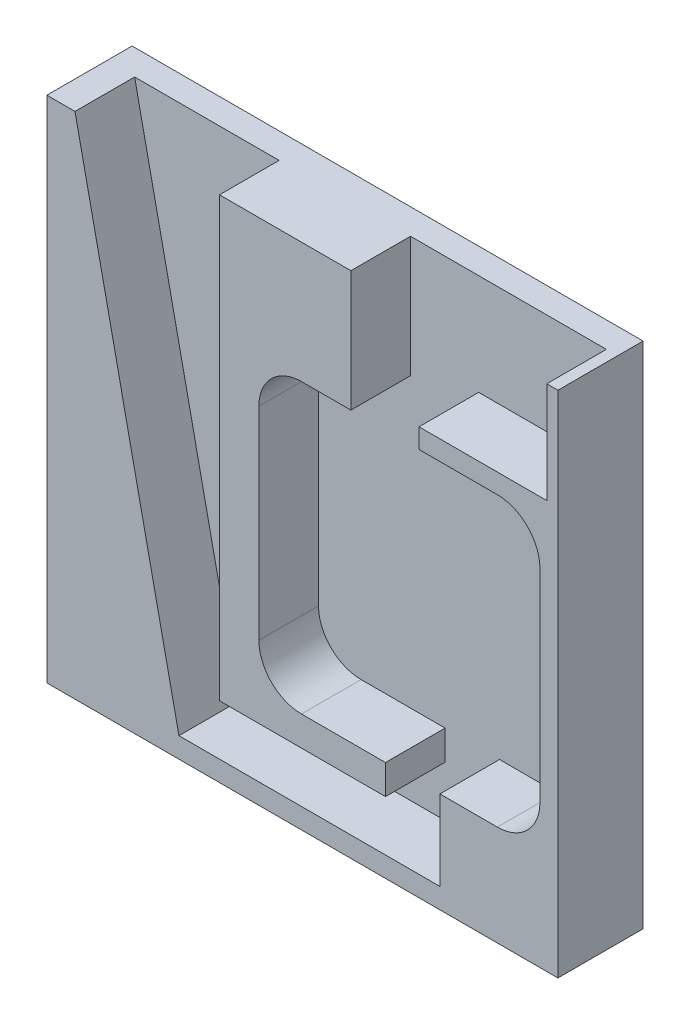
ISO-10303-21;
HEADER;
FILE_DESCRIPTION(('STEP AP214'),'2;1');
FILE_NAME('part.step','',(''),(''),'','','');
FILE_SCHEMA(('AUTOMOTIVE_DESIGN { 1 0 10303 214 1 1 1 1 }'));
ENDSEC;
DATA;
#1=APPLICATION_CONTEXT('core data for automotive mechanical design processes');
#2=APPLICATION_PROTOCOL_DEFINITION('international standard','automotive_design',2000,#1);
#3=PRODUCT_CONTEXT('',#1,'mechanical');
#4=PRODUCT('Part','Part','',(#3));
#5=PRODUCT_RELATED_PRODUCT_CATEGORY('part','',(#4));
#6=PRODUCT_DEFINITION_FORMATION('','',#4);
#7=PRODUCT_DEFINITION_CONTEXT('part definition',#1,'design');
#8=PRODUCT_DEFINITION('design','',#6,#7);
#9=PRODUCT_DEFINITION_SHAPE('','',#8);
#10=(LENGTH_UNIT() NAMED_UNIT(*) SI_UNIT(.MILLI.,.METRE.));
#11=(NAMED_UNIT(*) PLANE_ANGLE_UNIT() SI_UNIT($,.RADIAN.));
#12=(NAMED_UNIT(*) SI_UNIT($,.STERADIAN.) SOLID_ANGLE_UNIT());
#13=UNCERTAINTY_MEASURE_WITH_UNIT(LENGTH_MEASURE(1.E-05),#10,'distance_accuracy_value','');
#14=(GEOMETRIC_REPRESENTATION_CONTEXT(3) GLOBAL_UNCERTAINTY_ASSIGNED_CONTEXT((#13)) GLOBAL_UNIT_ASSIGNED_CONTEXT((#10,
#11,#12)) REPRESENTATION_CONTEXT('',''));
#15=CARTESIAN_POINT('',(0.,0.,0.));
#16=DIRECTION('',(0.,0.,1.));
#17=DIRECTION('',(1.,0.,0.));
#18=AXIS2_PLACEMENT_3D('',#15,#16,#17);
#19=CARTESIAN_POINT('',(0.,0.,10.));
#20=DIRECTION('',(0.,0.,1.));
#21=DIRECTION('',(1.,0.,0.));
#22=AXIS2_PLACEMENT_3D('',#19,#20,#21);
#23=PLANE('',#22);
#24=DIRECTION('',(0.,1.,0.));
#25=VECTOR('',#24,1.);
#26=CARTESIAN_POINT('',(7.9560990337825,-15.2293808870313,10.));
#27=LINE('',#26,#25);
#28=CARTESIAN_POINT('',(7.9560990337825,-24.6301306606249,10.));
#29=VERTEX_POINT('',#28);
#30=CARTESIAN_POINT('',(7.9560990337825,-15.2293808870313,10.));
#31=VERTEX_POINT('',#30);
#32=EDGE_CURVE('E261',#29,#31,#27,.T.);
#33=ORIENTED_EDGE('',*,*,#32,.F.);
#34=DIRECTION('',(1.,0.,0.));
#35=VECTOR('',#34,1.);
#36=CARTESIAN_POINT('',(1.56316592068764,-24.6301306606249,10.));
#37=LINE('',#36,#35);
#38=CARTESIAN_POINT('',(-22.6888435266912,-24.6301306606249,10.));
#39=VERTEX_POINT('',#38);
#40=EDGE_CURVE('E263',#39,#29,#37,.T.);
#41=ORIENTED_EDGE('',*,*,#40,.F.);
#42=DIRECTION('',(0.207957062909339,-0.97813795549816,0.));
#43=VECTOR('',#42,1.);
#44=CARTESIAN_POINT('',(-34.8884993322926,32.751649118956,10.));
#45=LINE('',#44,#43);
#46=CARTESIAN_POINT('',(-34.8884993322926,32.751649118956,10.));
#47=VERTEX_POINT('',#46);
#48=EDGE_CURVE('E281',#47,#39,#45,.T.);
#49=ORIENTED_EDGE('',*,*,#48,.F.);
#50=DIRECTION('',(-1.,0.,0.));
#51=VECTOR('',#50,1.);
#52=CARTESIAN_POINT('',(-28.1873658709764,32.7516491189561,10.));
#53=LINE('',#52,#51);
#54=CARTESIAN_POINT('',(-38.1873658709764,32.751649118956,10.));
#55=VERTEX_POINT('',#54);
#56=EDGE_CURVE('E408',#47,#55,#53,.T.);
#57=ORIENTED_EDGE('',*,*,#56,.T.);
#58=DIRECTION('',(0.,-1.,0.));
#59=VECTOR('',#58,1.);
#60=CARTESIAN_POINT('',(-38.1873658709764,32.751649118956,10.));
#61=LINE('',#60,#59);
#62=CARTESIAN_POINT('',(-38.1873658709764,-27.0178526667206,10.));
#63=VERTEX_POINT('',#62);
#64=EDGE_CURVE('E406',#55,#63,#61,.T.);
#65=ORIENTED_EDGE('',*,*,#64,.T.);
#66=DIRECTION('',(1.,0.,0.));
#67=VECTOR('',#66,1.);
#68=CARTESIAN_POINT('',(-28.1873658709764,-27.0178526667206,10.));
#69=LINE('',#68,#67);
#70=CARTESIAN_POINT('',(21.8126341290236,-27.0178526667206,10.));
#71=VERTEX_POINT('',#70);
#72=EDGE_CURVE('E410',#63,#71,#69,.T.);
#73=ORIENTED_EDGE('',*,*,#72,.T.);
#74=DIRECTION('',(0.,1.,0.));
#75=VECTOR('',#74,1.);
#76=CARTESIAN_POINT('',(21.8126341290236,32.7516491189561,10.));
#77=LINE('',#76,#75);
#78=CARTESIAN_POINT('',(21.8126341290236,32.7516491189561,10.));
#79=VERTEX_POINT('',#78);
#80=EDGE_CURVE('E412',#71,#79,#77,.T.);
#81=ORIENTED_EDGE('',*,*,#80,.T.);
#82=CARTESIAN_POINT('',(20.503263717641,32.751649118956,10.));
#83=VERTEX_POINT('',#82);
#84=EDGE_CURVE('E403',#79,#83,#53,.T.);
#85=ORIENTED_EDGE('',*,*,#84,.T.);
#86=DIRECTION('',(0.,-1.,0.));
#87=VECTOR('',#86,1.);
#88=CARTESIAN_POINT('',(20.503263717641,32.751649118956,10.));
#89=LINE('',#88,#87);
#90=CARTESIAN_POINT('',(20.503263717641,20.8766844809505,10.));
#91=VERTEX_POINT('',#90);
#92=EDGE_CURVE('E326',#83,#91,#89,.T.);
#93=ORIENTED_EDGE('',*,*,#92,.T.);
#94=DIRECTION('',(1.,0.,0.));
#95=VECTOR('',#94,1.);
#96=CARTESIAN_POINT('',(5.503263717641,20.8766844809505,10.));
#97=LINE('',#96,#95);
#98=CARTESIAN_POINT('',(5.503263717641,20.8766844809505,10.));
#99=VERTEX_POINT('',#98);
#100=EDGE_CURVE('E288',#99,#91,#97,.T.);
#101=ORIENTED_EDGE('',*,*,#100,.F.);
#102=DIRECTION('',(0.,-1.,0.));
#103=VECTOR('',#102,1.);
#104=CARTESIAN_POINT('',(5.503263717641,32.751649118956,10.));
#105=LINE('',#104,#103);
#106=CARTESIAN_POINT('',(5.503263717641,18.5706191129687,10.));
#107=VERTEX_POINT('',#106);
#108=EDGE_CURVE('E310',#99,#107,#105,.T.);
#109=ORIENTED_EDGE('',*,*,#108,.T.);
#110=DIRECTION('',(1.,0.,0.));
#111=VECTOR('',#110,1.);
#112=CARTESIAN_POINT('',(-8.29842081927149,18.5706191129687,10.));
#113=LINE('',#112,#111);
#114=CARTESIAN_POINT('',(14.7015791807285,18.5706191129687,10.));
#115=VERTEX_POINT('',#114);
#116=EDGE_CURVE('E381',#107,#115,#113,.T.);
#117=ORIENTED_EDGE('',*,*,#116,.T.);
#118=CARTESIAN_POINT('',(14.7015791807285,13.5706191129687,10.));
#119=DIRECTION('',(0.,0.,1.));
#120=DIRECTION('',(1.,0.,0.));
#121=AXIS2_PLACEMENT_3D('',#118,#119,#120);
#122=CIRCLE('',#121,5.);
#123=CARTESIAN_POINT('',(19.7015791807285,13.5706191129687,10.));
#124=VERTEX_POINT('',#123);
#125=EDGE_CURVE('E378',#124,#115,#122,.T.);
#126=ORIENTED_EDGE('',*,*,#125,.F.);
#127=DIRECTION('',(0.,-1.,0.));
#128=VECTOR('',#127,1.);
#129=CARTESIAN_POINT('',(19.7015791807285,13.5706191129687,10.));
#130=LINE('',#129,#128);
#131=CARTESIAN_POINT('',(19.7015791807285,-10.2293808870313,10.));
#132=VERTEX_POINT('',#131);
#133=EDGE_CURVE('E375',#124,#132,#130,.T.);
#134=ORIENTED_EDGE('',*,*,#133,.T.);
#135=CARTESIAN_POINT('',(14.7015791807285,-10.2293808870313,10.));
#136=DIRECTION('',(0.,0.,1.));
#137=DIRECTION('',(1.,0.,0.));
#138=AXIS2_PLACEMENT_3D('',#135,#136,#137);
#139=CIRCLE('',#138,5.);
#140=CARTESIAN_POINT('',(14.7015791807285,-15.2293808870313,10.));
#141=VERTEX_POINT('',#140);
#142=EDGE_CURVE('E372',#141,#132,#139,.T.);
#143=ORIENTED_EDGE('',*,*,#142,.F.);
#144=DIRECTION('',(1.,0.,0.));
#145=VECTOR('',#144,1.);
#146=CARTESIAN_POINT('',(-8.29842081927149,-15.2293808870313,10.));
#147=LINE('',#146,#145);
#148=EDGE_CURVE('E368',#31,#141,#147,.T.);
#149=ORIENTED_EDGE('',*,*,#148,.F.);
#150=EDGE_LOOP('',(#33,#41,#49,#57,#65,#73,#81,#85,#93,#101,#109,#117,#126,#134,#143,#149));
#151=FACE_BOUND('',#150,.T.);
#152=ADVANCED_FACE('F63',(#151),#23,.T.);
#153=CARTESIAN_POINT('',(-8.29842081927149,-15.2293808870313,3.));
#154=DIRECTION('',(0.,-1.,0.));
#155=DIRECTION('',(0.,0.,-1.));
#156=AXIS2_PLACEMENT_3D('',#153,#154,#155);
#157=PLANE('',#156);
#158=CARTESIAN_POINT('',(-8.29842081927149,-15.2293808870313,10.));
#159=VERTEX_POINT('',#158);
#160=CARTESIAN_POINT('',(1.56316592068764,-15.2293808870313,10.));
#161=VERTEX_POINT('',#160);
#162=EDGE_CURVE('E369',#159,#161,#147,.T.);
#163=ORIENTED_EDGE('',*,*,#162,.T.);
#164=DIRECTION('',(0.,0.,1.));
#165=VECTOR('',#164,1.);
#166=CARTESIAN_POINT('',(1.56316592068764,-15.2293808870313,3.));
#167=LINE('',#166,#165);
#168=CARTESIAN_POINT('',(1.56316592068764,-15.2293808870313,3.));
#169=VERTEX_POINT('',#168);
#170=EDGE_CURVE('E286',#169,#161,#167,.T.);
#171=ORIENTED_EDGE('',*,*,#170,.F.);
#172=DIRECTION('',(1.,0.,0.));
#173=VECTOR('',#172,1.);
#174=CARTESIAN_POINT('',(-8.29842081927149,-15.2293808870313,3.));
#175=LINE('',#174,#173);
#176=CARTESIAN_POINT('',(-8.29842081927149,-15.2293808870313,3.));
#177=VERTEX_POINT('',#176);
#178=EDGE_CURVE('E260',#177,#169,#175,.T.);
#179=ORIENTED_EDGE('',*,*,#178,.F.);
#180=DIRECTION('',(0.,0.,1.));
#181=VECTOR('',#180,1.);
#182=CARTESIAN_POINT('',(-8.29842081927149,-15.2293808870313,3.));
#183=LINE('',#182,#181);
#184=EDGE_CURVE('E397',#177,#159,#183,.T.);
#185=ORIENTED_EDGE('',*,*,#184,.T.);
#186=EDGE_LOOP('',(#163,#171,#179,#185));
#187=FACE_BOUND('',#186,.T.);
#188=ADVANCED_FACE('F520',(#187),#157,.F.);
#189=CARTESIAN_POINT('',(-8.29842081927149,18.5706191129687,3.));
#190=DIRECTION('',(0.,-1.,0.));
#191=DIRECTION('',(0.,0.,-1.));
#192=AXIS2_PLACEMENT_3D('',#189,#190,#191);
#193=PLANE('',#192);
#194=ORIENTED_EDGE('',*,*,#116,.F.);
#195=DIRECTION('',(0.,0.,1.));
#196=VECTOR('',#195,1.);
#197=CARTESIAN_POINT('',(5.503263717641,18.5706191129687,3.));
#198=LINE('',#197,#196);
#199=CARTESIAN_POINT('',(5.503263717641,18.5706191129687,3.));
#200=VERTEX_POINT('',#199);
#201=EDGE_CURVE('E309',#200,#107,#198,.T.);
#202=ORIENTED_EDGE('',*,*,#201,.F.);
#203=DIRECTION('',(1.,0.,0.));
#204=VECTOR('',#203,1.);
#205=CARTESIAN_POINT('',(-8.29842081927149,18.5706191129687,3.));
#206=LINE('',#205,#204);
#207=CARTESIAN_POINT('',(14.7015791807285,18.5706191129687,3.));
#208=VERTEX_POINT('',#207);
#209=EDGE_CURVE('E356',#200,#208,#206,.T.);
#210=ORIENTED_EDGE('',*,*,#209,.T.);
#211=DIRECTION('',(0.,0.,1.));
#212=VECTOR('',#211,1.);
#213=CARTESIAN_POINT('',(14.7015791807285,18.5706191129687,3.));
#214=LINE('',#213,#212);
#215=EDGE_CURVE('E387',#208,#115,#214,.T.);
#216=ORIENTED_EDGE('',*,*,#215,.T.);
#217=EDGE_LOOP('',(#194,#202,#210,#216));
#218=FACE_BOUND('',#217,.T.);
#219=ADVANCED_FACE('F496',(#218),#193,.T.);
#220=CARTESIAN_POINT('',(-38.1873658709764,32.751649118956,10.));
#221=DIRECTION('',(1.,0.,0.));
#222=DIRECTION('',(0.,1.,0.));
#223=AXIS2_PLACEMENT_3D('',#220,#221,#222);
#224=PLANE('',#223);
#225=DIRECTION('',(0.,-1.,0.));
#226=VECTOR('',#225,1.);
#227=CARTESIAN_POINT('',(-38.1873658709764,32.751649118956,0.));
#228=LINE('',#227,#226);
#229=CARTESIAN_POINT('',(-38.1873658709764,32.751649118956,0.));
#230=VERTEX_POINT('',#229);
#231=CARTESIAN_POINT('',(-38.1873658709764,-27.0178526667206,0.));
#232=VERTEX_POINT('',#231);
#233=EDGE_CURVE('E386',#230,#232,#228,.T.);
#234=ORIENTED_EDGE('',*,*,#233,.T.);
#235=DIRECTION('',(0.,0.,-1.));
#236=VECTOR('',#235,1.);
#237=CARTESIAN_POINT('',(-38.1873658709764,-27.0178526667206,10.));
#238=LINE('',#237,#236);
#239=EDGE_CURVE('E71',#63,#232,#238,.T.);
#240=ORIENTED_EDGE('',*,*,#239,.F.);
#241=ORIENTED_EDGE('',*,*,#64,.F.);
#242=DIRECTION('',(0.,0.,-1.));
#243=VECTOR('',#242,1.);
#244=CARTESIAN_POINT('',(-38.1873658709764,32.751649118956,10.));
#245=LINE('',#244,#243);
#246=EDGE_CURVE('E12',#55,#230,#245,.T.);
#247=ORIENTED_EDGE('',*,*,#246,.T.);
#248=EDGE_LOOP('',(#234,#240,#241,#247));
#249=FACE_BOUND('',#248,.T.);
#250=ADVANCED_FACE('F65',(#249),#224,.F.);
#251=CARTESIAN_POINT('',(-28.1873658709764,-27.0178526667206,10.));
#252=DIRECTION('',(0.,1.,0.));
#253=DIRECTION('',(0.,0.,1.));
#254=AXIS2_PLACEMENT_3D('',#251,#252,#253);
#255=PLANE('',#254);
#256=DIRECTION('',(1.,0.,0.));
#257=VECTOR('',#256,1.);
#258=CARTESIAN_POINT('',(-28.1873658709764,-27.0178526667206,0.));
#259=LINE('',#258,#257);
#260=CARTESIAN_POINT('',(21.8126341290236,-27.0178526667206,0.));
#261=VERTEX_POINT('',#260);
#262=EDGE_CURVE('E418',#232,#261,#259,.T.);
#263=ORIENTED_EDGE('',*,*,#262,.T.);
#264=DIRECTION('',(0.,0.,-1.));
#265=VECTOR('',#264,1.);
#266=CARTESIAN_POINT('',(21.8126341290236,-27.0178526667206,10.));
#267=LINE('',#266,#265);
#268=EDGE_CURVE('E426',#71,#261,#267,.T.);
#269=ORIENTED_EDGE('',*,*,#268,.F.);
#270=ORIENTED_EDGE('',*,*,#72,.F.);
#271=ORIENTED_EDGE('',*,*,#239,.T.);
#272=EDGE_LOOP('',(#263,#269,#270,#271));
#273=FACE_BOUND('',#272,.T.);
#274=ADVANCED_FACE('F432',(#273),#255,.F.);
#275=CARTESIAN_POINT('',(21.8126341290236,32.7516491189561,10.));
#276=DIRECTION('',(-1.,0.,0.));
#277=DIRECTION('',(0.,-1.,0.));
#278=AXIS2_PLACEMENT_3D('',#275,#276,#277);
#279=PLANE('',#278);
#280=DIRECTION('',(0.,1.,0.));
#281=VECTOR('',#280,1.);
#282=CARTESIAN_POINT('',(21.8126341290236,32.7516491189561,0.));
#283=LINE('',#282,#281);
#284=CARTESIAN_POINT('',(21.8126341290236,32.7516491189561,0.));
#285=VERTEX_POINT('',#284);
#286=EDGE_CURVE('E420',#261,#285,#283,.T.);
#287=ORIENTED_EDGE('',*,*,#286,.T.);
#288=DIRECTION('',(0.,0.,-1.));
#289=VECTOR('',#288,1.);
#290=CARTESIAN_POINT('',(21.8126341290236,32.7516491189561,10.));
#291=LINE('',#290,#289);
#292=EDGE_CURVE('E415',#79,#285,#291,.T.);
#293=ORIENTED_EDGE('',*,*,#292,.F.);
#294=ORIENTED_EDGE('',*,*,#80,.F.);
#295=ORIENTED_EDGE('',*,*,#268,.T.);
#296=EDGE_LOOP('',(#287,#293,#294,#295));
#297=FACE_BOUND('',#296,.T.);
#298=ADVANCED_FACE('F444',(#297),#279,.F.);
#299=CARTESIAN_POINT('',(-28.1873658709764,32.7516491189561,10.));
#300=DIRECTION('',(0.,-1.,0.));
#301=DIRECTION('',(0.,0.,-1.));
#302=AXIS2_PLACEMENT_3D('',#299,#300,#301);
#303=PLANE('',#302);
#304=ORIENTED_EDGE('',*,*,#56,.F.);
#305=DIRECTION('',(0.,0.,1.));
#306=VECTOR('',#305,1.);
#307=CARTESIAN_POINT('',(-34.8884993322926,32.751649118956,3.));
#308=LINE('',#307,#306);
#309=CARTESIAN_POINT('',(-34.8884993322926,32.751649118956,3.));
#310=VERTEX_POINT('',#309);
#311=EDGE_CURVE('E296',#310,#47,#308,.T.);
#312=ORIENTED_EDGE('',*,*,#311,.F.);
#313=DIRECTION('',(-1.,0.,0.));
#314=VECTOR('',#313,1.);
#315=CARTESIAN_POINT('',(-17.9237265806738,32.751649118956,3.));
#316=LINE('',#315,#314);
#317=CARTESIAN_POINT('',(-17.9237265806738,32.751649118956,3.));
#318=VERTEX_POINT('',#317);
#319=EDGE_CURVE('E267',#318,#310,#316,.T.);
#320=ORIENTED_EDGE('',*,*,#319,.F.);
#321=DIRECTION('',(0.,0.,1.));
#322=VECTOR('',#321,1.);
#323=CARTESIAN_POINT('',(-17.9237265806738,32.751649118956,3.));
#324=LINE('',#323,#322);
#325=CARTESIAN_POINT('',(-17.9237265806738,32.751649118956,10.));
#326=VERTEX_POINT('',#325);
#327=EDGE_CURVE('E298',#318,#326,#324,.T.);
#328=ORIENTED_EDGE('',*,*,#327,.T.);
#329=CARTESIAN_POINT('',(-2.496736282359,32.751649118956,10.));
#330=VERTEX_POINT('',#329);
#331=EDGE_CURVE('E407',#330,#326,#53,.T.);
#332=ORIENTED_EDGE('',*,*,#331,.F.);
#333=DIRECTION('',(0.,0.,1.));
#334=VECTOR('',#333,1.);
#335=CARTESIAN_POINT('',(-2.496736282359,32.751649118956,3.));
#336=LINE('',#335,#334);
#337=CARTESIAN_POINT('',(-2.496736282359,32.751649118956,3.));
#338=VERTEX_POINT('',#337);
#339=EDGE_CURVE('E319',#338,#330,#336,.T.);
#340=ORIENTED_EDGE('',*,*,#339,.F.);
#341=DIRECTION('',(1.,0.,0.));
#342=VECTOR('',#341,1.);
#343=CARTESIAN_POINT('',(-2.496736282359,32.751649118956,3.));
#344=LINE('',#343,#342);
#345=CARTESIAN_POINT('',(20.503263717641,32.751649118956,3.));
#346=VERTEX_POINT('',#345);
#347=EDGE_CURVE('E304',#338,#346,#344,.T.);
#348=ORIENTED_EDGE('',*,*,#347,.T.);
#349=DIRECTION('',(0.,0.,1.));
#350=VECTOR('',#349,1.);
#351=CARTESIAN_POINT('',(20.503263717641,32.751649118956,3.));
#352=LINE('',#351,#350);
#353=EDGE_CURVE('E313',#346,#83,#352,.T.);
#354=ORIENTED_EDGE('',*,*,#353,.T.);
#355=ORIENTED_EDGE('',*,*,#84,.F.);
#356=ORIENTED_EDGE('',*,*,#292,.T.);
#357=DIRECTION('',(-1.,0.,0.));
#358=VECTOR('',#357,1.);
#359=CARTESIAN_POINT('',(-28.1873658709764,32.7516491189561,0.));
#360=LINE('',#359,#358);
#361=EDGE_CURVE('E422',#285,#230,#360,.T.);
#362=ORIENTED_EDGE('',*,*,#361,.T.);
#363=ORIENTED_EDGE('',*,*,#246,.F.);
#364=EDGE_LOOP('',(#304,#312,#320,#328,#332,#340,#348,#354,#355,#356,#362,#363));
#365=FACE_BOUND('',#364,.T.);
#366=ADVANCED_FACE('F448',(#365),#303,.F.);
#367=DIRECTION('',(0.,-1.,0.));
#368=VECTOR('',#367,1.);
#369=CARTESIAN_POINT('',(1.56316592068764,-15.2293808870313,10.));
#370=LINE('',#369,#368);
#371=CARTESIAN_POINT('',(1.56316592068764,-18.6993372906454,10.));
#372=VERTEX_POINT('',#371);
#373=EDGE_CURVE('E242',#161,#372,#370,.T.);
#374=ORIENTED_EDGE('',*,*,#373,.F.);
#375=ORIENTED_EDGE('',*,*,#162,.F.);
#376=CARTESIAN_POINT('',(-8.2984208192715,-10.2293808870313,10.));
#377=DIRECTION('',(0.,0.,-1.));
#378=DIRECTION('',(-1.,0.,0.));
#379=AXIS2_PLACEMENT_3D('',#376,#377,#378);
#380=CIRCLE('',#379,5.);
#381=CARTESIAN_POINT('',(-13.2984208192715,-10.2293808870313,10.));
#382=VERTEX_POINT('',#381);
#383=EDGE_CURVE('E365',#159,#382,#380,.T.);
#384=ORIENTED_EDGE('',*,*,#383,.T.);
#385=DIRECTION('',(0.,-1.,0.));
#386=VECTOR('',#385,1.);
#387=CARTESIAN_POINT('',(-13.2984208192715,13.5706191129687,10.));
#388=LINE('',#387,#386);
#389=CARTESIAN_POINT('',(-13.2984208192715,13.5706191129687,10.));
#390=VERTEX_POINT('',#389);
#391=EDGE_CURVE('E362',#390,#382,#388,.T.);
#392=ORIENTED_EDGE('',*,*,#391,.F.);
#393=CARTESIAN_POINT('',(-8.2984208192715,13.5706191129687,10.));
#394=DIRECTION('',(0.,0.,1.));
#395=DIRECTION('',(1.,0.,0.));
#396=AXIS2_PLACEMENT_3D('',#393,#394,#395);
#397=CIRCLE('',#396,5.);
#398=CARTESIAN_POINT('',(-8.29842081927149,18.5706191129687,10.));
#399=VERTEX_POINT('',#398);
#400=EDGE_CURVE('E334',#399,#390,#397,.T.);
#401=ORIENTED_EDGE('',*,*,#400,.F.);
#402=CARTESIAN_POINT('',(-2.496736282359,18.5706191129687,10.));
#403=VERTEX_POINT('',#402);
#404=EDGE_CURVE('E341',#399,#403,#113,.T.);
#405=ORIENTED_EDGE('',*,*,#404,.T.);
#406=DIRECTION('',(0.,-1.,0.));
#407=VECTOR('',#406,1.);
#408=CARTESIAN_POINT('',(-2.496736282359,32.751649118956,10.));
#409=LINE('',#408,#407);
#410=EDGE_CURVE('E305',#330,#403,#409,.T.);
#411=ORIENTED_EDGE('',*,*,#410,.F.);
#412=ORIENTED_EDGE('',*,*,#331,.T.);
#413=DIRECTION('',(0.,1.,0.));
#414=VECTOR('',#413,1.);
#415=CARTESIAN_POINT('',(-17.9237265806738,-18.6993372906454,10.));
#416=LINE('',#415,#414);
#417=CARTESIAN_POINT('',(-17.9237265806738,-18.6993372906454,10.));
#418=VERTEX_POINT('',#417);
#419=EDGE_CURVE('E279',#418,#326,#416,.T.);
#420=ORIENTED_EDGE('',*,*,#419,.F.);
#421=DIRECTION('',(-1.,0.,0.));
#422=VECTOR('',#421,1.);
#423=CARTESIAN_POINT('',(-17.9237265806738,-18.6993372906454,10.));
#424=LINE('',#423,#422);
#425=EDGE_CURVE('E277',#372,#418,#424,.T.);
#426=ORIENTED_EDGE('',*,*,#425,.F.);
#427=EDGE_LOOP('',(#374,#375,#384,#392,#401,#405,#411,#412,#420,#426));
#428=FACE_BOUND('',#427,.T.);
#429=ADVANCED_FACE('F459',(#428),#23,.T.);
#430=CARTESIAN_POINT('',(0.,0.,0.));
#431=DIRECTION('',(0.,0.,1.));
#432=DIRECTION('',(1.,0.,0.));
#433=AXIS2_PLACEMENT_3D('',#430,#431,#432);
#434=PLANE('',#433);
#435=ORIENTED_EDGE('',*,*,#233,.F.);
#436=ORIENTED_EDGE('',*,*,#361,.F.);
#437=ORIENTED_EDGE('',*,*,#286,.F.);
#438=ORIENTED_EDGE('',*,*,#262,.F.);
#439=EDGE_LOOP('',(#435,#436,#437,#438));
#440=FACE_BOUND('',#439,.T.);
#441=ADVANCED_FACE('F440',(#440),#434,.F.);
#442=CARTESIAN_POINT('',(-8.2984208192715,13.5706191129687,3.));
#443=DIRECTION('',(0.,0.,1.));
#444=DIRECTION('',(1.,0.,0.));
#445=AXIS2_PLACEMENT_3D('',#442,#443,#444);
#446=CYLINDRICAL_SURFACE('',#445,5.);
#447=ORIENTED_EDGE('',*,*,#400,.T.);
#448=DIRECTION('',(0.,0.,1.));
#449=VECTOR('',#448,1.);
#450=CARTESIAN_POINT('',(-13.2984208192715,13.5706191129687,3.));
#451=LINE('',#450,#449);
#452=CARTESIAN_POINT('',(-13.2984208192715,13.5706191129687,3.));
#453=VERTEX_POINT('',#452);
#454=EDGE_CURVE('E360',#453,#390,#451,.T.);
#455=ORIENTED_EDGE('',*,*,#454,.F.);
#456=CARTESIAN_POINT('',(-8.2984208192715,13.5706191129687,3.));
#457=DIRECTION('',(0.,0.,1.));
#458=DIRECTION('',(1.,0.,0.));
#459=AXIS2_PLACEMENT_3D('',#456,#457,#458);
#460=CIRCLE('',#459,5.);
#461=CARTESIAN_POINT('',(-8.29842081927149,18.5706191129687,3.));
#462=VERTEX_POINT('',#461);
#463=EDGE_CURVE('E338',#462,#453,#460,.T.);
#464=ORIENTED_EDGE('',*,*,#463,.F.);
#465=DIRECTION('',(0.,0.,1.));
#466=VECTOR('',#465,1.);
#467=CARTESIAN_POINT('',(-8.29842081927149,18.5706191129687,3.));
#468=LINE('',#467,#466);
#469=EDGE_CURVE('E384',#462,#399,#468,.T.);
#470=ORIENTED_EDGE('',*,*,#469,.T.);
#471=EDGE_LOOP('',(#447,#455,#464,#470));
#472=FACE_BOUND('',#471,.T.);
#473=ADVANCED_FACE('F535',(#472),#446,.F.);
#474=DIRECTION('',(0.,0.,1.));
#475=VECTOR('',#474,1.);
#476=CARTESIAN_POINT('',(-2.496736282359,18.5706191129687,3.));
#477=LINE('',#476,#475);
#478=CARTESIAN_POINT('',(-2.496736282359,18.5706191129687,3.));
#479=VERTEX_POINT('',#478);
#480=EDGE_CURVE('E315',#479,#403,#477,.T.);
#481=ORIENTED_EDGE('',*,*,#480,.T.);
#482=ORIENTED_EDGE('',*,*,#404,.F.);
#483=ORIENTED_EDGE('',*,*,#469,.F.);
#484=EDGE_CURVE('E357',#462,#479,#206,.T.);
#485=ORIENTED_EDGE('',*,*,#484,.T.);
#486=EDGE_LOOP('',(#481,#482,#483,#485));
#487=FACE_BOUND('',#486,.T.);
#488=ADVANCED_FACE('F549',(#487),#193,.T.);
#489=CARTESIAN_POINT('',(14.7015791807285,13.5706191129687,3.));
#490=DIRECTION('',(0.,0.,1.));
#491=DIRECTION('',(1.,0.,0.));
#492=AXIS2_PLACEMENT_3D('',#489,#490,#491);
#493=CYLINDRICAL_SURFACE('',#492,5.);
#494=ORIENTED_EDGE('',*,*,#125,.T.);
#495=ORIENTED_EDGE('',*,*,#215,.F.);
#496=CARTESIAN_POINT('',(14.7015791807285,13.5706191129687,3.));
#497=DIRECTION('',(0.,0.,1.));
#498=DIRECTION('',(1.,0.,0.));
#499=AXIS2_PLACEMENT_3D('',#496,#497,#498);
#500=CIRCLE('',#499,5.);
#501=CARTESIAN_POINT('',(19.7015791807285,13.5706191129687,3.));
#502=VERTEX_POINT('',#501);
#503=EDGE_CURVE('E353',#502,#208,#500,.T.);
#504=ORIENTED_EDGE('',*,*,#503,.F.);
#505=DIRECTION('',(0.,0.,1.));
#506=VECTOR('',#505,1.);
#507=CARTESIAN_POINT('',(19.7015791807285,13.5706191129687,3.));
#508=LINE('',#507,#506);
#509=EDGE_CURVE('E390',#502,#124,#508,.T.);
#510=ORIENTED_EDGE('',*,*,#509,.T.);
#511=EDGE_LOOP('',(#494,#495,#504,#510));
#512=FACE_BOUND('',#511,.T.);
#513=ADVANCED_FACE('F489',(#512),#493,.F.);
#514=CARTESIAN_POINT('',(19.7015791807285,13.5706191129687,3.));
#515=DIRECTION('',(-1.,0.,0.));
#516=DIRECTION('',(0.,0.,1.));
#517=AXIS2_PLACEMENT_3D('',#514,#515,#516);
#518=PLANE('',#517);
#519=ORIENTED_EDGE('',*,*,#133,.F.);
#520=ORIENTED_EDGE('',*,*,#509,.F.);
#521=DIRECTION('',(0.,-1.,0.));
#522=VECTOR('',#521,1.);
#523=CARTESIAN_POINT('',(19.7015791807285,13.5706191129687,3.));
#524=LINE('',#523,#522);
#525=CARTESIAN_POINT('',(19.7015791807285,-10.2293808870313,3.));
#526=VERTEX_POINT('',#525);
#527=EDGE_CURVE('E351',#502,#526,#524,.T.);
#528=ORIENTED_EDGE('',*,*,#527,.T.);
#529=DIRECTION('',(0.,0.,1.));
#530=VECTOR('',#529,1.);
#531=CARTESIAN_POINT('',(19.7015791807285,-10.2293808870313,3.));
#532=LINE('',#531,#530);
#533=EDGE_CURVE('E392',#526,#132,#532,.T.);
#534=ORIENTED_EDGE('',*,*,#533,.T.);
#535=EDGE_LOOP('',(#519,#520,#528,#534));
#536=FACE_BOUND('',#535,.T.);
#537=ADVANCED_FACE('F486',(#536),#518,.T.);
#538=CARTESIAN_POINT('',(14.7015791807285,-10.2293808870313,3.));
#539=DIRECTION('',(0.,0.,1.));
#540=DIRECTION('',(1.,0.,0.));
#541=AXIS2_PLACEMENT_3D('',#538,#539,#540);
#542=CYLINDRICAL_SURFACE('',#541,5.);
#543=ORIENTED_EDGE('',*,*,#142,.T.);
#544=ORIENTED_EDGE('',*,*,#533,.F.);
#545=CARTESIAN_POINT('',(14.7015791807285,-10.2293808870313,3.));
#546=DIRECTION('',(0.,0.,1.));
#547=DIRECTION('',(1.,0.,0.));
#548=AXIS2_PLACEMENT_3D('',#545,#546,#547);
#549=CIRCLE('',#548,5.);
#550=CARTESIAN_POINT('',(14.7015791807285,-15.2293808870313,3.));
#551=VERTEX_POINT('',#550);
#552=EDGE_CURVE('E348',#551,#526,#549,.T.);
#553=ORIENTED_EDGE('',*,*,#552,.F.);
#554=DIRECTION('',(0.,0.,1.));
#555=VECTOR('',#554,1.);
#556=CARTESIAN_POINT('',(14.7015791807285,-15.2293808870313,3.));
#557=LINE('',#556,#555);
#558=EDGE_CURVE('E394',#551,#141,#557,.T.);
#559=ORIENTED_EDGE('',*,*,#558,.T.);
#560=EDGE_LOOP('',(#543,#544,#553,#559));
#561=FACE_BOUND('',#560,.T.);
#562=ADVANCED_FACE('F482',(#561),#542,.F.);
#563=CARTESIAN_POINT('',(7.9560990337825,-15.2293808870313,3.));
#564=VERTEX_POINT('',#563);
#565=EDGE_CURVE('E346',#564,#551,#175,.T.);
#566=ORIENTED_EDGE('',*,*,#565,.F.);
#567=DIRECTION('',(0.,0.,1.));
#568=VECTOR('',#567,1.);
#569=CARTESIAN_POINT('',(7.9560990337825,-15.2293808870313,3.));
#570=LINE('',#569,#568);
#571=EDGE_CURVE('E289',#564,#31,#570,.T.);
#572=ORIENTED_EDGE('',*,*,#571,.T.);
#573=ORIENTED_EDGE('',*,*,#148,.T.);
#574=ORIENTED_EDGE('',*,*,#558,.F.);
#575=EDGE_LOOP('',(#566,#572,#573,#574));
#576=FACE_BOUND('',#575,.T.);
#577=ADVANCED_FACE('F476',(#576),#157,.F.);
#578=CARTESIAN_POINT('',(-8.2984208192715,-10.2293808870313,3.));
#579=DIRECTION('',(0.,0.,1.));
#580=DIRECTION('',(1.,0.,0.));
#581=AXIS2_PLACEMENT_3D('',#578,#579,#580);
#582=CYLINDRICAL_SURFACE('',#581,5.);
#583=ORIENTED_EDGE('',*,*,#383,.F.);
#584=ORIENTED_EDGE('',*,*,#184,.F.);
#585=CARTESIAN_POINT('',(-8.2984208192715,-10.2293808870313,3.));
#586=DIRECTION('',(0.,0.,-1.));
#587=DIRECTION('',(-1.,0.,0.));
#588=AXIS2_PLACEMENT_3D('',#585,#586,#587);
#589=CIRCLE('',#588,5.);
#590=CARTESIAN_POINT('',(-13.2984208192715,-10.2293808870313,3.));
#591=VERTEX_POINT('',#590);
#592=EDGE_CURVE('E344',#177,#591,#589,.T.);
#593=ORIENTED_EDGE('',*,*,#592,.T.);
#594=DIRECTION('',(0.,0.,1.));
#595=VECTOR('',#594,1.);
#596=CARTESIAN_POINT('',(-13.2984208192715,-10.2293808870313,3.));
#597=LINE('',#596,#595);
#598=EDGE_CURVE('E399',#591,#382,#597,.T.);
#599=ORIENTED_EDGE('',*,*,#598,.T.);
#600=EDGE_LOOP('',(#583,#584,#593,#599));
#601=FACE_BOUND('',#600,.T.);
#602=ADVANCED_FACE('F575',(#601),#582,.F.);
#603=CARTESIAN_POINT('',(-13.2984208192715,13.5706191129687,3.));
#604=DIRECTION('',(-1.,0.,0.));
#605=DIRECTION('',(0.,-1.,0.));
#606=AXIS2_PLACEMENT_3D('',#603,#604,#605);
#607=PLANE('',#606);
#608=ORIENTED_EDGE('',*,*,#391,.T.);
#609=ORIENTED_EDGE('',*,*,#598,.F.);
#610=DIRECTION('',(0.,-1.,0.));
#611=VECTOR('',#610,1.);
#612=CARTESIAN_POINT('',(-13.2984208192715,13.5706191129687,3.));
#613=LINE('',#612,#611);
#614=EDGE_CURVE('E340',#453,#591,#613,.T.);
#615=ORIENTED_EDGE('',*,*,#614,.F.);
#616=ORIENTED_EDGE('',*,*,#454,.T.);
#617=EDGE_LOOP('',(#608,#609,#615,#616));
#618=FACE_BOUND('',#617,.T.);
#619=ADVANCED_FACE('F570',(#618),#607,.F.);
#620=CARTESIAN_POINT('',(-8.2984208192715,13.5706191129687,3.));
#621=DIRECTION('',(0.,0.,1.));
#622=DIRECTION('',(1.,0.,0.));
#623=AXIS2_PLACEMENT_3D('',#620,#621,#622);
#624=PLANE('',#623);
#625=ORIENTED_EDGE('',*,*,#463,.T.);
#626=ORIENTED_EDGE('',*,*,#614,.T.);
#627=ORIENTED_EDGE('',*,*,#592,.F.);
#628=ORIENTED_EDGE('',*,*,#178,.T.);
#629=DIRECTION('',(0.,-1.,0.));
#630=VECTOR('',#629,1.);
#631=CARTESIAN_POINT('',(1.56316592068764,-15.2293808870313,3.));
#632=LINE('',#631,#630);
#633=CARTESIAN_POINT('',(1.56316592068764,-18.6993372906454,3.));
#634=VERTEX_POINT('',#633);
#635=EDGE_CURVE('E239',#169,#634,#632,.T.);
#636=ORIENTED_EDGE('',*,*,#635,.T.);
#637=DIRECTION('',(-1.,0.,0.));
#638=VECTOR('',#637,1.);
#639=CARTESIAN_POINT('',(-17.9237265806738,-18.6993372906454,3.));
#640=LINE('',#639,#638);
#641=CARTESIAN_POINT('',(-17.9237265806738,-18.6993372906454,3.));
#642=VERTEX_POINT('',#641);
#643=EDGE_CURVE('E249',#634,#642,#640,.T.);
#644=ORIENTED_EDGE('',*,*,#643,.T.);
#645=DIRECTION('',(0.,1.,0.));
#646=VECTOR('',#645,1.);
#647=CARTESIAN_POINT('',(-17.9237265806738,-18.6993372906454,3.));
#648=LINE('',#647,#646);
#649=EDGE_CURVE('E253',#642,#318,#648,.T.);
#650=ORIENTED_EDGE('',*,*,#649,.T.);
#651=ORIENTED_EDGE('',*,*,#319,.T.);
#652=DIRECTION('',(0.207957062909339,-0.97813795549816,0.));
#653=VECTOR('',#652,1.);
#654=CARTESIAN_POINT('',(-34.8884993322926,32.751649118956,3.));
#655=LINE('',#654,#653);
#656=CARTESIAN_POINT('',(-22.6888435266912,-24.6301306606249,3.));
#657=VERTEX_POINT('',#656);
#658=EDGE_CURVE('E270',#310,#657,#655,.T.);
#659=ORIENTED_EDGE('',*,*,#658,.T.);
#660=DIRECTION('',(1.,0.,0.));
#661=VECTOR('',#660,1.);
#662=CARTESIAN_POINT('',(-22.6888435266912,-24.6301306606249,3.));
#663=LINE('',#662,#661);
#664=CARTESIAN_POINT('',(7.9560990337825,-24.6301306606249,3.));
#665=VERTEX_POINT('',#664);
#666=EDGE_CURVE('E273',#657,#665,#663,.T.);
#667=ORIENTED_EDGE('',*,*,#666,.T.);
#668=DIRECTION('',(0.,1.,0.));
#669=VECTOR('',#668,1.);
#670=CARTESIAN_POINT('',(7.9560990337825,-15.2293808870313,3.));
#671=LINE('',#670,#669);
#672=EDGE_CURVE('E78',#665,#564,#671,.T.);
#673=ORIENTED_EDGE('',*,*,#672,.T.);
#674=ORIENTED_EDGE('',*,*,#565,.T.);
#675=ORIENTED_EDGE('',*,*,#552,.T.);
#676=ORIENTED_EDGE('',*,*,#527,.F.);
#677=ORIENTED_EDGE('',*,*,#503,.T.);
#678=ORIENTED_EDGE('',*,*,#209,.F.);
#679=DIRECTION('',(0.,-1.,0.));
#680=VECTOR('',#679,1.);
#681=CARTESIAN_POINT('',(5.503263717641,32.751649118956,3.));
#682=LINE('',#681,#680);
#683=CARTESIAN_POINT('',(5.503263717641,20.8766844809505,3.));
#684=VERTEX_POINT('',#683);
#685=EDGE_CURVE('E302',#684,#200,#682,.T.);
#686=ORIENTED_EDGE('',*,*,#685,.F.);
#687=DIRECTION('',(1.,0.,0.));
#688=VECTOR('',#687,1.);
#689=CARTESIAN_POINT('',(5.503263717641,20.8766844809505,3.));
#690=LINE('',#689,#688);
#691=CARTESIAN_POINT('',(20.503263717641,20.8766844809505,3.));
#692=VERTEX_POINT('',#691);
#693=EDGE_CURVE('E322',#684,#692,#690,.T.);
#694=ORIENTED_EDGE('',*,*,#693,.T.);
#695=DIRECTION('',(0.,-1.,0.));
#696=VECTOR('',#695,1.);
#697=CARTESIAN_POINT('',(20.503263717641,32.751649118956,3.));
#698=LINE('',#697,#696);
#699=EDGE_CURVE('E325',#346,#692,#698,.T.);
#700=ORIENTED_EDGE('',*,*,#699,.F.);
#701=ORIENTED_EDGE('',*,*,#347,.F.);
#702=DIRECTION('',(0.,-1.,0.));
#703=VECTOR('',#702,1.);
#704=CARTESIAN_POINT('',(-2.496736282359,32.751649118956,3.));
#705=LINE('',#704,#703);
#706=EDGE_CURVE('E85',#338,#479,#705,.T.);
#707=ORIENTED_EDGE('',*,*,#706,.T.);
#708=ORIENTED_EDGE('',*,*,#484,.F.);
#709=EDGE_LOOP('',(#625,#626,#627,#628,#636,#644,#650,#651,#659,#667,#673,#674,#675,#676,#677,
#678,#686,#694,#700,#701,#707,#708));
#710=FACE_BOUND('',#709,.T.);
#711=ADVANCED_FACE('F257',(#710),#624,.T.);
#712=CARTESIAN_POINT('',(-2.496736282359,32.751649118956,3.));
#713=DIRECTION('',(-1.,0.,0.));
#714=DIRECTION('',(0.,-1.,0.));
#715=AXIS2_PLACEMENT_3D('',#712,#713,#714);
#716=PLANE('',#715);
#717=ORIENTED_EDGE('',*,*,#410,.T.);
#718=ORIENTED_EDGE('',*,*,#480,.F.);
#719=ORIENTED_EDGE('',*,*,#706,.F.);
#720=ORIENTED_EDGE('',*,*,#339,.T.);
#721=EDGE_LOOP('',(#717,#718,#719,#720));
#722=FACE_BOUND('',#721,.T.);
#723=ADVANCED_FACE('F515',(#722),#716,.F.);
#724=CARTESIAN_POINT('',(5.503263717641,32.751649118956,3.));
#725=DIRECTION('',(-1.,0.,0.));
#726=DIRECTION('',(0.,-1.,0.));
#727=AXIS2_PLACEMENT_3D('',#724,#725,#726);
#728=PLANE('',#727);
#729=ORIENTED_EDGE('',*,*,#685,.T.);
#730=ORIENTED_EDGE('',*,*,#201,.T.);
#731=ORIENTED_EDGE('',*,*,#108,.F.);
#732=DIRECTION('',(0.,0.,1.));
#733=VECTOR('',#732,1.);
#734=CARTESIAN_POINT('',(5.503263717641,20.8766844809505,3.));
#735=LINE('',#734,#733);
#736=EDGE_CURVE('E318',#684,#99,#735,.T.);
#737=ORIENTED_EDGE('',*,*,#736,.F.);
#738=EDGE_LOOP('',(#729,#730,#731,#737));
#739=FACE_BOUND('',#738,.T.);
#740=ADVANCED_FACE('F499',(#739),#728,.T.);
#741=CARTESIAN_POINT('',(20.503263717641,32.751649118956,3.));
#742=DIRECTION('',(-1.,0.,0.));
#743=DIRECTION('',(0.,0.,1.));
#744=AXIS2_PLACEMENT_3D('',#741,#742,#743);
#745=PLANE('',#744);
#746=ORIENTED_EDGE('',*,*,#92,.F.);
#747=ORIENTED_EDGE('',*,*,#353,.F.);
#748=ORIENTED_EDGE('',*,*,#699,.T.);
#749=DIRECTION('',(0.,0.,1.));
#750=VECTOR('',#749,1.);
#751=CARTESIAN_POINT('',(20.503263717641,20.8766844809505,3.));
#752=LINE('',#751,#750);
#753=EDGE_CURVE('E328',#692,#91,#752,.T.);
#754=ORIENTED_EDGE('',*,*,#753,.T.);
#755=EDGE_LOOP('',(#746,#747,#748,#754));
#756=FACE_BOUND('',#755,.T.);
#757=ADVANCED_FACE('F507',(#756),#745,.T.);
#758=CARTESIAN_POINT('',(5.503263717641,20.8766844809505,3.));
#759=DIRECTION('',(0.,-1.,0.));
#760=DIRECTION('',(0.,0.,-1.));
#761=AXIS2_PLACEMENT_3D('',#758,#759,#760);
#762=PLANE('',#761);
#763=ORIENTED_EDGE('',*,*,#100,.T.);
#764=ORIENTED_EDGE('',*,*,#753,.F.);
#765=ORIENTED_EDGE('',*,*,#693,.F.);
#766=ORIENTED_EDGE('',*,*,#736,.T.);
#767=EDGE_LOOP('',(#763,#764,#765,#766));
#768=FACE_BOUND('',#767,.T.);
#769=ADVANCED_FACE('F503',(#768),#762,.F.);
#770=CARTESIAN_POINT('',(1.56316592068764,-15.2293808870313,3.));
#771=DIRECTION('',(-1.,0.,0.));
#772=DIRECTION('',(0.,0.,1.));
#773=AXIS2_PLACEMENT_3D('',#770,#771,#772);
#774=PLANE('',#773);
#775=ORIENTED_EDGE('',*,*,#373,.T.);
#776=DIRECTION('',(0.,0.,1.));
#777=VECTOR('',#776,1.);
#778=CARTESIAN_POINT('',(1.56316592068764,-18.6993372906454,3.));
#779=LINE('',#778,#777);
#780=EDGE_CURVE('E235',#634,#372,#779,.T.);
#781=ORIENTED_EDGE('',*,*,#780,.F.);
#782=ORIENTED_EDGE('',*,*,#635,.F.);
#783=ORIENTED_EDGE('',*,*,#170,.T.);
#784=EDGE_LOOP('',(#775,#781,#782,#783));
#785=FACE_BOUND('',#784,.T.);
#786=ADVANCED_FACE('F237',(#785),#774,.F.);
#787=CARTESIAN_POINT('',(7.9560990337825,-15.2293808870313,3.));
#788=DIRECTION('',(1.,0.,0.));
#789=DIRECTION('',(0.,0.,-1.));
#790=AXIS2_PLACEMENT_3D('',#787,#788,#789);
#791=PLANE('',#790);
#792=ORIENTED_EDGE('',*,*,#32,.T.);
#793=ORIENTED_EDGE('',*,*,#571,.F.);
#794=ORIENTED_EDGE('',*,*,#672,.F.);
#795=DIRECTION('',(0.,0.,1.));
#796=VECTOR('',#795,1.);
#797=CARTESIAN_POINT('',(7.9560990337825,-24.6301306606249,3.));
#798=LINE('',#797,#796);
#799=EDGE_CURVE('E292',#665,#29,#798,.T.);
#800=ORIENTED_EDGE('',*,*,#799,.T.);
#801=EDGE_LOOP('',(#792,#793,#794,#800));
#802=FACE_BOUND('',#801,.T.);
#803=ADVANCED_FACE('F471',(#802),#791,.F.);
#804=CARTESIAN_POINT('',(1.56316592068764,-24.6301306606249,3.));
#805=DIRECTION('',(0.,-1.,0.));
#806=DIRECTION('',(0.,0.,-1.));
#807=AXIS2_PLACEMENT_3D('',#804,#805,#806);
#808=PLANE('',#807);
#809=ORIENTED_EDGE('',*,*,#40,.T.);
#810=ORIENTED_EDGE('',*,*,#799,.F.);
#811=ORIENTED_EDGE('',*,*,#666,.F.);
#812=DIRECTION('',(0.,0.,1.));
#813=VECTOR('',#812,1.);
#814=CARTESIAN_POINT('',(-22.6888435266912,-24.6301306606249,3.));
#815=LINE('',#814,#813);
#816=EDGE_CURVE('E294',#657,#39,#815,.T.);
#817=ORIENTED_EDGE('',*,*,#816,.T.);
#818=EDGE_LOOP('',(#809,#810,#811,#817));
#819=FACE_BOUND('',#818,.T.);
#820=ADVANCED_FACE('F469',(#819),#808,.F.);
#821=CARTESIAN_POINT('',(-34.8884993322926,32.751649118956,3.));
#822=DIRECTION('',(-0.97813795549816,-0.207957062909339,0.));
#823=DIRECTION('',(0.207957062909339,-0.978137955498161,0.));
#824=AXIS2_PLACEMENT_3D('',#821,#822,#823);
#825=PLANE('',#824);
#826=ORIENTED_EDGE('',*,*,#48,.T.);
#827=ORIENTED_EDGE('',*,*,#816,.F.);
#828=ORIENTED_EDGE('',*,*,#658,.F.);
#829=ORIENTED_EDGE('',*,*,#311,.T.);
#830=EDGE_LOOP('',(#826,#827,#828,#829));
#831=FACE_BOUND('',#830,.T.);
#832=ADVANCED_FACE('F465',(#831),#825,.F.);
#833=CARTESIAN_POINT('',(-17.9237265806738,-18.6993372906454,3.));
#834=DIRECTION('',(1.,0.,0.));
#835=DIRECTION('',(0.,0.,-1.));
#836=AXIS2_PLACEMENT_3D('',#833,#834,#835);
#837=PLANE('',#836);
#838=ORIENTED_EDGE('',*,*,#419,.T.);
#839=ORIENTED_EDGE('',*,*,#327,.F.);
#840=ORIENTED_EDGE('',*,*,#649,.F.);
#841=DIRECTION('',(0.,0.,1.));
#842=VECTOR('',#841,1.);
#843=CARTESIAN_POINT('',(-17.9237265806738,-18.6993372906454,3.));
#844=LINE('',#843,#842);
#845=EDGE_CURVE('E246',#642,#418,#844,.T.);
#846=ORIENTED_EDGE('',*,*,#845,.T.);
#847=EDGE_LOOP('',(#838,#839,#840,#846));
#848=FACE_BOUND('',#847,.T.);
#849=ADVANCED_FACE('F463',(#848),#837,.F.);
#850=CARTESIAN_POINT('',(-17.9237265806738,-18.6993372906454,3.));
#851=DIRECTION('',(0.,1.,0.));
#852=DIRECTION('',(0.,0.,1.));
#853=AXIS2_PLACEMENT_3D('',#850,#851,#852);
#854=PLANE('',#853);
#855=ORIENTED_EDGE('',*,*,#425,.T.);
#856=ORIENTED_EDGE('',*,*,#845,.F.);
#857=ORIENTED_EDGE('',*,*,#643,.F.);
#858=ORIENTED_EDGE('',*,*,#780,.T.);
#859=EDGE_LOOP('',(#855,#856,#857,#858));
#860=FACE_BOUND('',#859,.T.);
#861=ADVANCED_FACE('F250',(#860),#854,.F.);
#862=CLOSED_SHELL('',(#152,#188,#219,#250,#274,#298,#366,#429,#441,#473,#488,#513,#537,#562,
#577,#602,#619,#711,#723,#740,#757,#769,#786,#803,#820,#832,#849,#861));
#863=MANIFOLD_SOLID_BREP('B2',#862);
#864=ADVANCED_BREP_SHAPE_REPRESENTATION('',(#18,#863),#14);
#865=SHAPE_DEFINITION_REPRESENTATION(#9,#864);
ENDSEC;
END-ISO-10303-21;
